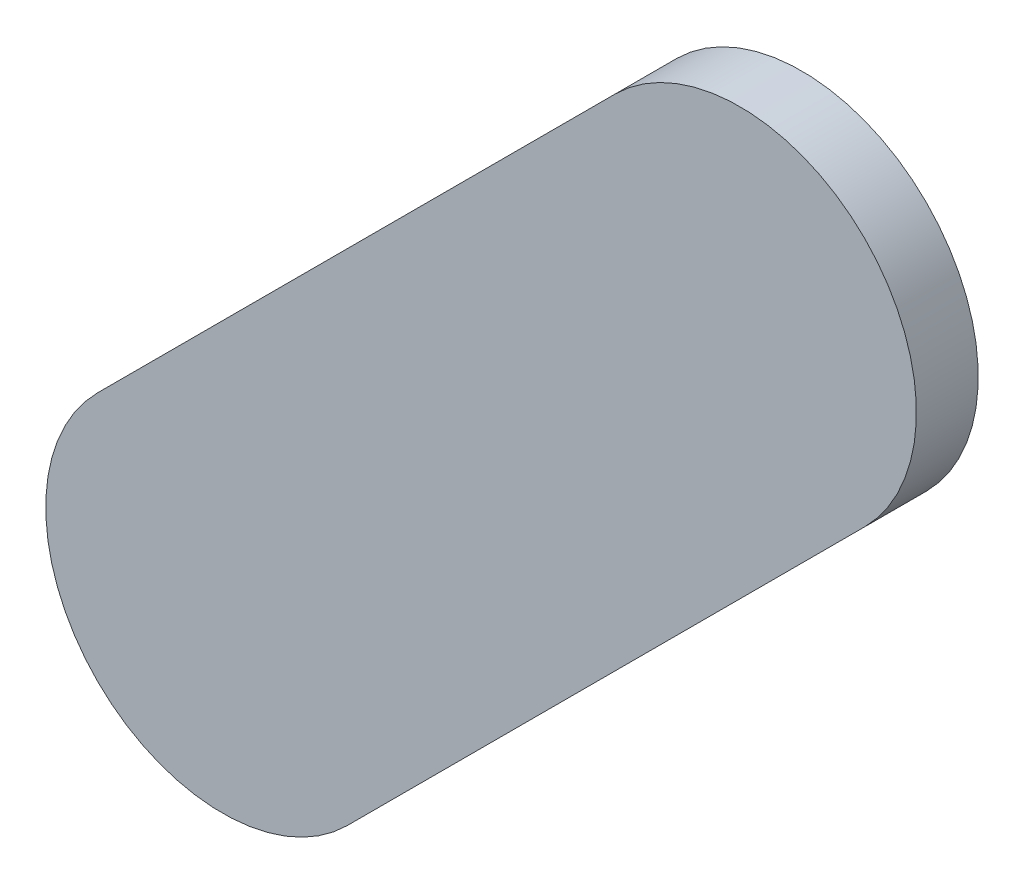
ISO-10303-21;
HEADER;
FILE_DESCRIPTION(('STEP AP214'),'2;1');
FILE_NAME('part.step','',(''),(''),'','','');
FILE_SCHEMA(('AUTOMOTIVE_DESIGN { 1 0 10303 214 1 1 1 1 }'));
ENDSEC;
DATA;
#1=APPLICATION_CONTEXT('core data for automotive mechanical design processes');
#2=APPLICATION_PROTOCOL_DEFINITION('international standard','automotive_design',2000,#1);
#3=PRODUCT_CONTEXT('',#1,'mechanical');
#4=PRODUCT('Part','Part','',(#3));
#5=PRODUCT_RELATED_PRODUCT_CATEGORY('part','',(#4));
#6=PRODUCT_DEFINITION_FORMATION('','',#4);
#7=PRODUCT_DEFINITION_CONTEXT('part definition',#1,'design');
#8=PRODUCT_DEFINITION('design','',#6,#7);
#9=PRODUCT_DEFINITION_SHAPE('','',#8);
#10=(LENGTH_UNIT() NAMED_UNIT(*) SI_UNIT(.MILLI.,.METRE.));
#11=(NAMED_UNIT(*) PLANE_ANGLE_UNIT() SI_UNIT($,.RADIAN.));
#12=(NAMED_UNIT(*) SI_UNIT($,.STERADIAN.) SOLID_ANGLE_UNIT());
#13=UNCERTAINTY_MEASURE_WITH_UNIT(LENGTH_MEASURE(1.E-05),#10,'distance_accuracy_value','');
#14=(GEOMETRIC_REPRESENTATION_CONTEXT(3) GLOBAL_UNCERTAINTY_ASSIGNED_CONTEXT((#13)) GLOBAL_UNIT_ASSIGNED_CONTEXT((#10,
#11,#12)) REPRESENTATION_CONTEXT('',''));
#15=CARTESIAN_POINT('',(0.,0.,0.));
#16=DIRECTION('',(0.,0.,1.));
#17=DIRECTION('',(1.,0.,0.));
#18=AXIS2_PLACEMENT_3D('',#15,#16,#17);
#19=CARTESIAN_POINT('',(102.67071,-104.763603,1.635));
#20=DIRECTION('',(0.,0.,1.));
#21=DIRECTION('',(1.,0.,0.));
#22=AXIS2_PLACEMENT_3D('',#19,#20,#21);
#23=PLANE('',#22);
#24=DIRECTION('',(0.707106781186548,0.707106781186548,0.));
#25=VECTOR('',#24,1.);
#26=CARTESIAN_POINT('',(102.67071,-104.763603,1.635));
#27=LINE('',#26,#25);
#28=CARTESIAN_POINT('',(102.67071,-104.763603,1.635));
#29=VERTEX_POINT('',#28);
#30=CARTESIAN_POINT('',(102.963603,-104.47071,1.635));
#31=VERTEX_POINT('',#30);
#32=EDGE_CURVE('E70',#29,#31,#27,.T.);
#33=ORIENTED_EDGE('',*,*,#32,.T.);
#34=CARTESIAN_POINT('',(102.8928925,-104.3999995,1.635));
#35=DIRECTION('',(0.,0.,1.));
#36=DIRECTION('',(0.707106781187047,-0.707106781186048,0.));
#37=AXIS2_PLACEMENT_3D('',#34,#35,#36);
#38=CIRCLE('',#37,0.09999974810219);
#39=CARTESIAN_POINT('',(102.822182,-104.329289,1.635));
#40=VERTEX_POINT('',#39);
#41=EDGE_CURVE('E105',#31,#40,#38,.T.);
#42=ORIENTED_EDGE('',*,*,#41,.T.);
#43=DIRECTION('',(-0.707106781186548,-0.707106781186548,0.));
#44=VECTOR('',#43,1.);
#45=CARTESIAN_POINT('',(102.822182,-104.329289,1.635));
#46=LINE('',#45,#44);
#47=CARTESIAN_POINT('',(102.529289,-104.622182,1.635));
#48=VERTEX_POINT('',#47);
#49=EDGE_CURVE('E72',#40,#48,#46,.T.);
#50=ORIENTED_EDGE('',*,*,#49,.T.);
#51=CARTESIAN_POINT('',(102.5999995,-104.6928925,1.635));
#52=DIRECTION('',(0.,0.,1.));
#53=DIRECTION('',(-0.707106781186048,0.707106781187048,0.));
#54=AXIS2_PLACEMENT_3D('',#51,#52,#53);
#55=CIRCLE('',#54,0.09999974810218);
#56=EDGE_CURVE('E11',#48,#29,#55,.T.);
#57=ORIENTED_EDGE('',*,*,#56,.T.);
#58=EDGE_LOOP('',(#33,#42,#50,#57));
#59=FACE_BOUND('',#58,.T.);
#60=ADVANCED_FACE('F17',(#59),#23,.T.);
#61=CARTESIAN_POINT('',(102.67071,-104.763603,1.6));
#62=DIRECTION('',(0.,0.,1.));
#63=DIRECTION('',(1.,0.,0.));
#64=AXIS2_PLACEMENT_3D('',#61,#62,#63);
#65=PLANE('',#64);
#66=CARTESIAN_POINT('',(102.5999995,-104.6928925,1.6));
#67=DIRECTION('',(0.,0.,1.));
#68=DIRECTION('',(-0.707106781186048,0.707106781187048,0.));
#69=AXIS2_PLACEMENT_3D('',#66,#67,#68);
#70=CIRCLE('',#69,0.09999974810218);
#71=CARTESIAN_POINT('',(102.529289,-104.622182,1.6));
#72=VERTEX_POINT('',#71);
#73=CARTESIAN_POINT('',(102.67071,-104.763603,1.6));
#74=VERTEX_POINT('',#73);
#75=EDGE_CURVE('E25',#72,#74,#70,.T.);
#76=ORIENTED_EDGE('',*,*,#75,.F.);
#77=DIRECTION('',(-0.707106781186548,-0.707106781186548,0.));
#78=VECTOR('',#77,1.);
#79=CARTESIAN_POINT('',(102.822182,-104.329289,1.6));
#80=LINE('',#79,#78);
#81=CARTESIAN_POINT('',(102.822182,-104.329289,1.6));
#82=VERTEX_POINT('',#81);
#83=EDGE_CURVE('E107',#82,#72,#80,.T.);
#84=ORIENTED_EDGE('',*,*,#83,.F.);
#85=CARTESIAN_POINT('',(102.8928925,-104.3999995,1.6));
#86=DIRECTION('',(0.,0.,1.));
#87=DIRECTION('',(0.707106781187047,-0.707106781186048,0.));
#88=AXIS2_PLACEMENT_3D('',#85,#86,#87);
#89=CIRCLE('',#88,0.09999974810219);
#90=CARTESIAN_POINT('',(102.963603,-104.47071,1.6));
#91=VERTEX_POINT('',#90);
#92=EDGE_CURVE('E80',#91,#82,#89,.T.);
#93=ORIENTED_EDGE('',*,*,#92,.F.);
#94=DIRECTION('',(0.707106781186548,0.707106781186548,0.));
#95=VECTOR('',#94,1.);
#96=CARTESIAN_POINT('',(102.67071,-104.763603,1.6));
#97=LINE('',#96,#95);
#98=EDGE_CURVE('E91',#74,#91,#97,.T.);
#99=ORIENTED_EDGE('',*,*,#98,.F.);
#100=EDGE_LOOP('',(#76,#84,#93,#99));
#101=FACE_BOUND('',#100,.T.);
#102=ADVANCED_FACE('F125',(#101),#65,.F.);
#103=CARTESIAN_POINT('',(102.5999995,-104.6928925,1.6));
#104=DIRECTION('',(0.,0.,-1.));
#105=DIRECTION('',(-0.707106781186048,0.707106781187048,0.));
#106=AXIS2_PLACEMENT_3D('',#103,#104,#105);
#107=CYLINDRICAL_SURFACE('',#106,0.09999974810218);
#108=ORIENTED_EDGE('',*,*,#75,.T.);
#109=DIRECTION('',(0.,0.,1.));
#110=VECTOR('',#109,1.);
#111=CARTESIAN_POINT('',(102.67071,-104.763603,1.6));
#112=LINE('',#111,#110);
#113=EDGE_CURVE('E75',#74,#29,#112,.T.);
#114=ORIENTED_EDGE('',*,*,#113,.T.);
#115=ORIENTED_EDGE('',*,*,#56,.F.);
#116=DIRECTION('',(0.,0.,1.));
#117=VECTOR('',#116,1.);
#118=CARTESIAN_POINT('',(102.529289,-104.622182,1.6));
#119=LINE('',#118,#117);
#120=EDGE_CURVE('E94',#72,#48,#119,.T.);
#121=ORIENTED_EDGE('',*,*,#120,.F.);
#122=EDGE_LOOP('',(#108,#114,#115,#121));
#123=FACE_BOUND('',#122,.T.);
#124=ADVANCED_FACE('F76',(#123),#107,.T.);
#125=CARTESIAN_POINT('',(102.822182,-104.329289,1.6));
#126=DIRECTION('',(0.707106781186548,-0.707106781186548,0.));
#127=DIRECTION('',(0.,0.,-1.));
#128=AXIS2_PLACEMENT_3D('',#125,#126,#127);
#129=PLANE('',#128);
#130=ORIENTED_EDGE('',*,*,#83,.T.);
#131=ORIENTED_EDGE('',*,*,#120,.T.);
#132=ORIENTED_EDGE('',*,*,#49,.F.);
#133=DIRECTION('',(0.,0.,1.));
#134=VECTOR('',#133,1.);
#135=CARTESIAN_POINT('',(102.822182,-104.329289,1.6));
#136=LINE('',#135,#134);
#137=EDGE_CURVE('E101',#82,#40,#136,.T.);
#138=ORIENTED_EDGE('',*,*,#137,.F.);
#139=EDGE_LOOP('',(#130,#131,#132,#138));
#140=FACE_BOUND('',#139,.T.);
#141=ADVANCED_FACE('F128',(#140),#129,.F.);
#142=CARTESIAN_POINT('',(102.8928925,-104.3999995,1.6));
#143=DIRECTION('',(0.,0.,-1.));
#144=DIRECTION('',(0.707106781187048,-0.707106781186048,0.));
#145=AXIS2_PLACEMENT_3D('',#142,#143,#144);
#146=CYLINDRICAL_SURFACE('',#145,0.09999974810219);
#147=ORIENTED_EDGE('',*,*,#92,.T.);
#148=ORIENTED_EDGE('',*,*,#137,.T.);
#149=ORIENTED_EDGE('',*,*,#41,.F.);
#150=DIRECTION('',(0.,0.,1.));
#151=VECTOR('',#150,1.);
#152=CARTESIAN_POINT('',(102.963603,-104.47071,1.6));
#153=LINE('',#152,#151);
#154=EDGE_CURVE('E84',#91,#31,#153,.T.);
#155=ORIENTED_EDGE('',*,*,#154,.F.);
#156=EDGE_LOOP('',(#147,#148,#149,#155));
#157=FACE_BOUND('',#156,.T.);
#158=ADVANCED_FACE('F127',(#157),#146,.T.);
#159=CARTESIAN_POINT('',(102.67071,-104.763603,1.6));
#160=DIRECTION('',(-0.707106781186548,0.707106781186548,0.));
#161=DIRECTION('',(0.,0.,1.));
#162=AXIS2_PLACEMENT_3D('',#159,#160,#161);
#163=PLANE('',#162);
#164=ORIENTED_EDGE('',*,*,#98,.T.);
#165=ORIENTED_EDGE('',*,*,#154,.T.);
#166=ORIENTED_EDGE('',*,*,#32,.F.);
#167=ORIENTED_EDGE('',*,*,#113,.F.);
#168=EDGE_LOOP('',(#164,#165,#166,#167));
#169=FACE_BOUND('',#168,.T.);
#170=ADVANCED_FACE('F82',(#169),#163,.F.);
#171=CLOSED_SHELL('',(#60,#102,#124,#141,#158,#170));
#172=MANIFOLD_SOLID_BREP('B1',#171);
#173=ADVANCED_BREP_SHAPE_REPRESENTATION('',(#18,#172),#14);
#174=SHAPE_DEFINITION_REPRESENTATION(#9,#173);
ENDSEC;
END-ISO-10303-21;
